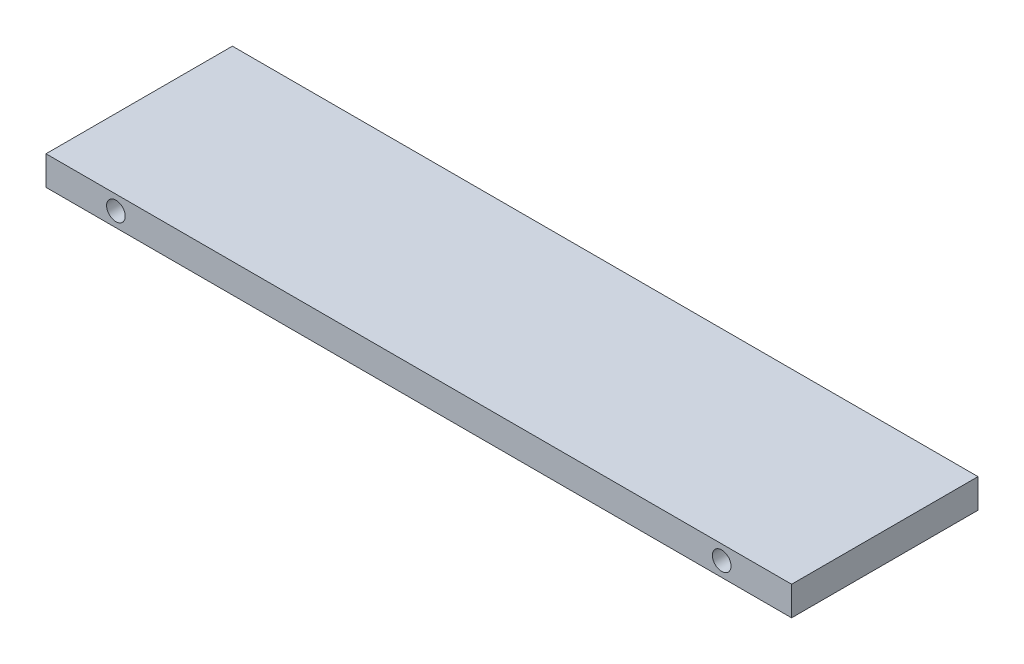
ISO-10303-21;
HEADER;
FILE_DESCRIPTION(('STEP AP214'),'2;1');
FILE_NAME('part.step','',(''),(''),'','','');
FILE_SCHEMA(('AUTOMOTIVE_DESIGN { 1 0 10303 214 1 1 1 1 }'));
ENDSEC;
DATA;
#1=APPLICATION_CONTEXT('core data for automotive mechanical design processes');
#2=APPLICATION_PROTOCOL_DEFINITION('international standard','automotive_design',2000,#1);
#3=PRODUCT_CONTEXT('',#1,'mechanical');
#4=PRODUCT('Part','Part','',(#3));
#5=PRODUCT_RELATED_PRODUCT_CATEGORY('part','',(#4));
#6=PRODUCT_DEFINITION_FORMATION('','',#4);
#7=PRODUCT_DEFINITION_CONTEXT('part definition',#1,'design');
#8=PRODUCT_DEFINITION('design','',#6,#7);
#9=PRODUCT_DEFINITION_SHAPE('','',#8);
#10=(LENGTH_UNIT() NAMED_UNIT(*) SI_UNIT(.MILLI.,.METRE.));
#11=(NAMED_UNIT(*) PLANE_ANGLE_UNIT() SI_UNIT($,.RADIAN.));
#12=(NAMED_UNIT(*) SI_UNIT($,.STERADIAN.) SOLID_ANGLE_UNIT());
#13=UNCERTAINTY_MEASURE_WITH_UNIT(LENGTH_MEASURE(1.E-05),#10,'distance_accuracy_value','');
#14=(GEOMETRIC_REPRESENTATION_CONTEXT(3) GLOBAL_UNCERTAINTY_ASSIGNED_CONTEXT((#13)) GLOBAL_UNIT_ASSIGNED_CONTEXT((#10,
#11,#12)) REPRESENTATION_CONTEXT('',''));
#15=CARTESIAN_POINT('',(0.,0.,0.));
#16=DIRECTION('',(0.,0.,1.));
#17=DIRECTION('',(1.,0.,0.));
#18=AXIS2_PLACEMENT_3D('',#15,#16,#17);
#19=CARTESIAN_POINT('',(0.,0.,58.));
#20=DIRECTION('',(0.,0.,1.));
#21=DIRECTION('',(1.,0.,0.));
#22=AXIS2_PLACEMENT_3D('',#19,#20,#21);
#23=PLANE('',#22);
#24=CARTESIAN_POINT('',(-26.,45.,58.));
#25=DIRECTION('',(0.,0.,1.));
#26=DIRECTION('',(1.,0.,0.));
#27=AXIS2_PLACEMENT_3D('',#24,#25,#26);
#28=CIRCLE('',#27,0.799999999999999);
#29=CARTESIAN_POINT('',(-25.2,45.,58.));
#30=VERTEX_POINT('',#29);
#31=EDGE_CURVE('E106',#30,#30,#28,.T.);
#32=ORIENTED_EDGE('',*,*,#31,.F.);
#33=EDGE_LOOP('',(#32));
#34=FACE_BOUND('',#33,.T.);
#35=DIRECTION('',(0.,-1.,0.));
#36=VECTOR('',#35,1.);
#37=CARTESIAN_POINT('',(-32.,46.25,58.));
#38=LINE('',#37,#36);
#39=CARTESIAN_POINT('',(-32.,46.25,58.));
#40=VERTEX_POINT('',#39);
#41=CARTESIAN_POINT('',(-32.,43.75,58.));
#42=VERTEX_POINT('',#41);
#43=EDGE_CURVE('E92',#40,#42,#38,.T.);
#44=ORIENTED_EDGE('',*,*,#43,.T.);
#45=DIRECTION('',(1.,0.,0.));
#46=VECTOR('',#45,1.);
#47=CARTESIAN_POINT('',(-32.,43.75,58.));
#48=LINE('',#47,#46);
#49=CARTESIAN_POINT('',(32.,43.75,58.));
#50=VERTEX_POINT('',#49);
#51=EDGE_CURVE('E88',#42,#50,#48,.T.);
#52=ORIENTED_EDGE('',*,*,#51,.T.);
#53=DIRECTION('',(0.,1.,0.));
#54=VECTOR('',#53,1.);
#55=CARTESIAN_POINT('',(32.,43.75,58.));
#56=LINE('',#55,#54);
#57=CARTESIAN_POINT('',(32.,46.25,58.));
#58=VERTEX_POINT('',#57);
#59=EDGE_CURVE('E89',#50,#58,#56,.T.);
#60=ORIENTED_EDGE('',*,*,#59,.T.);
#61=DIRECTION('',(-1.,0.,0.));
#62=VECTOR('',#61,1.);
#63=CARTESIAN_POINT('',(32.,46.25,58.));
#64=LINE('',#63,#62);
#65=EDGE_CURVE('E57',#58,#40,#64,.T.);
#66=ORIENTED_EDGE('',*,*,#65,.T.);
#67=EDGE_LOOP('',(#44,#52,#60,#66));
#68=FACE_BOUND('',#67,.T.);
#69=CARTESIAN_POINT('',(26.,45.,58.));
#70=DIRECTION('',(0.,0.,1.));
#71=DIRECTION('',(1.,0.,0.));
#72=AXIS2_PLACEMENT_3D('',#69,#70,#71);
#73=CIRCLE('',#72,0.799999999999999);
#74=CARTESIAN_POINT('',(26.8,45.,58.));
#75=VERTEX_POINT('',#74);
#76=EDGE_CURVE('E122',#75,#75,#73,.T.);
#77=ORIENTED_EDGE('',*,*,#76,.F.);
#78=EDGE_LOOP('',(#77));
#79=FACE_BOUND('',#78,.T.);
#80=ADVANCED_FACE('F39',(#34,#68,#79),#23,.T.);
#81=CARTESIAN_POINT('',(0.,0.,42.));
#82=DIRECTION('',(0.,0.,1.));
#83=DIRECTION('',(1.,0.,0.));
#84=AXIS2_PLACEMENT_3D('',#81,#82,#83);
#85=PLANE('',#84);
#86=DIRECTION('',(0.,-1.,0.));
#87=VECTOR('',#86,1.);
#88=CARTESIAN_POINT('',(-32.,46.25,42.));
#89=LINE('',#88,#87);
#90=CARTESIAN_POINT('',(-32.,46.25,42.));
#91=VERTEX_POINT('',#90);
#92=CARTESIAN_POINT('',(-32.,43.75,42.));
#93=VERTEX_POINT('',#92);
#94=EDGE_CURVE('E101',#91,#93,#89,.T.);
#95=ORIENTED_EDGE('',*,*,#94,.F.);
#96=DIRECTION('',(-1.,0.,0.));
#97=VECTOR('',#96,1.);
#98=CARTESIAN_POINT('',(32.,46.25,42.));
#99=LINE('',#98,#97);
#100=CARTESIAN_POINT('',(32.,46.25,42.));
#101=VERTEX_POINT('',#100);
#102=EDGE_CURVE('E79',#101,#91,#99,.T.);
#103=ORIENTED_EDGE('',*,*,#102,.F.);
#104=DIRECTION('',(0.,1.,0.));
#105=VECTOR('',#104,1.);
#106=CARTESIAN_POINT('',(32.,43.75,42.));
#107=LINE('',#106,#105);
#108=CARTESIAN_POINT('',(32.,43.75,42.));
#109=VERTEX_POINT('',#108);
#110=EDGE_CURVE('E73',#109,#101,#107,.T.);
#111=ORIENTED_EDGE('',*,*,#110,.F.);
#112=DIRECTION('',(1.,0.,0.));
#113=VECTOR('',#112,1.);
#114=CARTESIAN_POINT('',(-32.,43.75,42.));
#115=LINE('',#114,#113);
#116=EDGE_CURVE('E91',#93,#109,#115,.T.);
#117=ORIENTED_EDGE('',*,*,#116,.F.);
#118=EDGE_LOOP('',(#95,#103,#111,#117));
#119=FACE_BOUND('',#118,.T.);
#120=CARTESIAN_POINT('',(-26.,45.,42.));
#121=DIRECTION('',(0.,0.,1.));
#122=DIRECTION('',(1.,0.,0.));
#123=AXIS2_PLACEMENT_3D('',#120,#121,#122);
#124=CIRCLE('',#123,0.799999999999999);
#125=CARTESIAN_POINT('',(-25.2,45.,42.));
#126=VERTEX_POINT('',#125);
#127=EDGE_CURVE('E117',#126,#126,#124,.T.);
#128=ORIENTED_EDGE('',*,*,#127,.T.);
#129=EDGE_LOOP('',(#128));
#130=FACE_BOUND('',#129,.T.);
#131=CARTESIAN_POINT('',(26.,45.,42.));
#132=DIRECTION('',(0.,0.,1.));
#133=DIRECTION('',(1.,0.,0.));
#134=AXIS2_PLACEMENT_3D('',#131,#132,#133);
#135=CIRCLE('',#134,0.799999999999999);
#136=CARTESIAN_POINT('',(26.8,45.,42.));
#137=VERTEX_POINT('',#136);
#138=EDGE_CURVE('E121',#137,#137,#135,.T.);
#139=ORIENTED_EDGE('',*,*,#138,.T.);
#140=EDGE_LOOP('',(#139));
#141=FACE_BOUND('',#140,.T.);
#142=ADVANCED_FACE('F112',(#119,#130,#141),#85,.F.);
#143=CARTESIAN_POINT('',(-32.,46.25,58.));
#144=DIRECTION('',(1.,0.,0.));
#145=DIRECTION('',(0.,0.,-1.));
#146=AXIS2_PLACEMENT_3D('',#143,#144,#145);
#147=PLANE('',#146);
#148=ORIENTED_EDGE('',*,*,#94,.T.);
#149=DIRECTION('',(0.,0.,-1.));
#150=VECTOR('',#149,1.);
#151=CARTESIAN_POINT('',(-32.,43.75,58.));
#152=LINE('',#151,#150);
#153=EDGE_CURVE('E11',#42,#93,#152,.T.);
#154=ORIENTED_EDGE('',*,*,#153,.F.);
#155=ORIENTED_EDGE('',*,*,#43,.F.);
#156=DIRECTION('',(0.,0.,-1.));
#157=VECTOR('',#156,1.);
#158=CARTESIAN_POINT('',(-32.,46.25,58.));
#159=LINE('',#158,#157);
#160=EDGE_CURVE('E100',#40,#91,#159,.T.);
#161=ORIENTED_EDGE('',*,*,#160,.T.);
#162=EDGE_LOOP('',(#148,#154,#155,#161));
#163=FACE_BOUND('',#162,.T.);
#164=ADVANCED_FACE('F41',(#163),#147,.F.);
#165=CARTESIAN_POINT('',(-32.,43.75,58.));
#166=DIRECTION('',(0.,1.,0.));
#167=DIRECTION('',(0.,0.,1.));
#168=AXIS2_PLACEMENT_3D('',#165,#166,#167);
#169=PLANE('',#168);
#170=ORIENTED_EDGE('',*,*,#116,.T.);
#171=DIRECTION('',(0.,0.,-1.));
#172=VECTOR('',#171,1.);
#173=CARTESIAN_POINT('',(32.,43.75,58.));
#174=LINE('',#173,#172);
#175=EDGE_CURVE('E48',#50,#109,#174,.T.);
#176=ORIENTED_EDGE('',*,*,#175,.F.);
#177=ORIENTED_EDGE('',*,*,#51,.F.);
#178=ORIENTED_EDGE('',*,*,#153,.T.);
#179=EDGE_LOOP('',(#170,#176,#177,#178));
#180=FACE_BOUND('',#179,.T.);
#181=ADVANCED_FACE('F94',(#180),#169,.F.);
#182=CARTESIAN_POINT('',(32.,43.75,58.));
#183=DIRECTION('',(-1.,0.,0.));
#184=DIRECTION('',(0.,0.,1.));
#185=AXIS2_PLACEMENT_3D('',#182,#183,#184);
#186=PLANE('',#185);
#187=ORIENTED_EDGE('',*,*,#110,.T.);
#188=DIRECTION('',(0.,0.,-1.));
#189=VECTOR('',#188,1.);
#190=CARTESIAN_POINT('',(32.,46.25,58.));
#191=LINE('',#190,#189);
#192=EDGE_CURVE('E98',#58,#101,#191,.T.);
#193=ORIENTED_EDGE('',*,*,#192,.F.);
#194=ORIENTED_EDGE('',*,*,#59,.F.);
#195=ORIENTED_EDGE('',*,*,#175,.T.);
#196=EDGE_LOOP('',(#187,#193,#194,#195));
#197=FACE_BOUND('',#196,.T.);
#198=ADVANCED_FACE('F97',(#197),#186,.F.);
#199=CARTESIAN_POINT('',(32.,46.25,58.));
#200=DIRECTION('',(0.,-1.,0.));
#201=DIRECTION('',(0.,0.,-1.));
#202=AXIS2_PLACEMENT_3D('',#199,#200,#201);
#203=PLANE('',#202);
#204=ORIENTED_EDGE('',*,*,#102,.T.);
#205=ORIENTED_EDGE('',*,*,#160,.F.);
#206=ORIENTED_EDGE('',*,*,#65,.F.);
#207=ORIENTED_EDGE('',*,*,#192,.T.);
#208=EDGE_LOOP('',(#204,#205,#206,#207));
#209=FACE_BOUND('',#208,.T.);
#210=ADVANCED_FACE('F111',(#209),#203,.F.);
#211=CARTESIAN_POINT('',(-26.,45.,58.));
#212=DIRECTION('',(0.,0.,-1.));
#213=DIRECTION('',(-1.,0.,0.));
#214=AXIS2_PLACEMENT_3D('',#211,#212,#213);
#215=CYLINDRICAL_SURFACE('',#214,0.799999999999999);
#216=ORIENTED_EDGE('',*,*,#31,.T.);
#217=EDGE_LOOP('',(#216));
#218=FACE_BOUND('',#217,.T.);
#219=ORIENTED_EDGE('',*,*,#127,.F.);
#220=EDGE_LOOP('',(#219));
#221=FACE_BOUND('',#220,.T.);
#222=ADVANCED_FACE('F142',(#218,#221),#215,.F.);
#223=CARTESIAN_POINT('',(26.,45.,58.));
#224=DIRECTION('',(0.,0.,-1.));
#225=DIRECTION('',(-1.,0.,0.));
#226=AXIS2_PLACEMENT_3D('',#223,#224,#225);
#227=CYLINDRICAL_SURFACE('',#226,0.799999999999999);
#228=ORIENTED_EDGE('',*,*,#76,.T.);
#229=EDGE_LOOP('',(#228));
#230=FACE_BOUND('',#229,.T.);
#231=ORIENTED_EDGE('',*,*,#138,.F.);
#232=EDGE_LOOP('',(#231));
#233=FACE_BOUND('',#232,.T.);
#234=ADVANCED_FACE('F128',(#230,#233),#227,.F.);
#235=CLOSED_SHELL('',(#80,#142,#164,#181,#198,#210,#222,#234));
#236=MANIFOLD_SOLID_BREP('B2',#235);
#237=ADVANCED_BREP_SHAPE_REPRESENTATION('',(#18,#236),#14);
#238=SHAPE_DEFINITION_REPRESENTATION(#9,#237);
ENDSEC;
END-ISO-10303-21;
